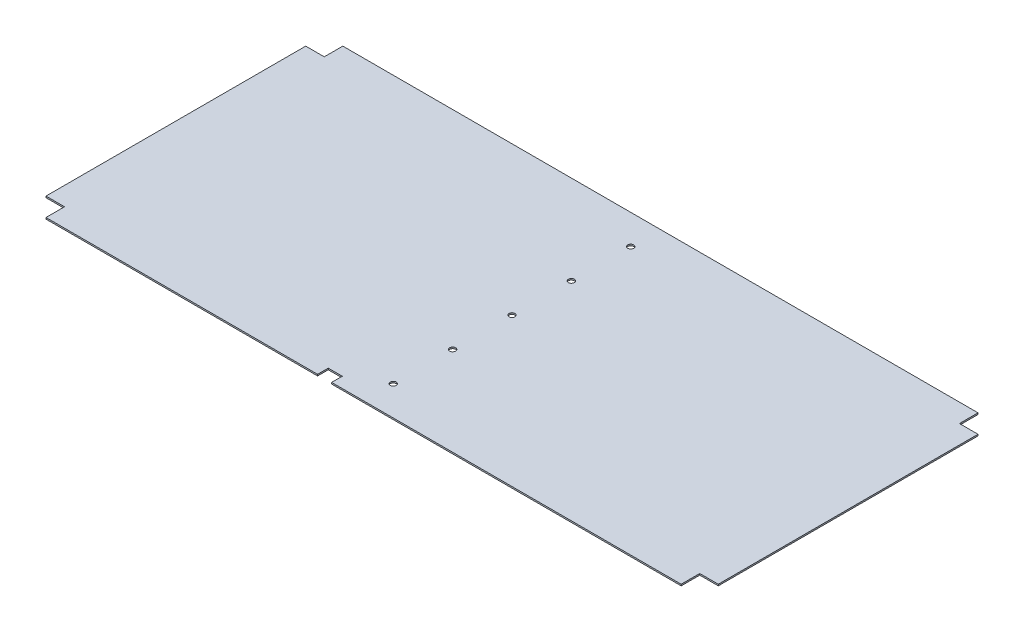
ISO-10303-21;
HEADER;
FILE_DESCRIPTION(('STEP AP214'),'2;1');
FILE_NAME('part.step','',(''),(''),'','','');
FILE_SCHEMA(('AUTOMOTIVE_DESIGN { 1 0 10303 214 1 1 1 1 }'));
ENDSEC;
DATA;
#1=APPLICATION_CONTEXT('core data for automotive mechanical design processes');
#2=APPLICATION_PROTOCOL_DEFINITION('international standard','automotive_design',2000,#1);
#3=PRODUCT_CONTEXT('',#1,'mechanical');
#4=PRODUCT('Part','Part','',(#3));
#5=PRODUCT_RELATED_PRODUCT_CATEGORY('part','',(#4));
#6=PRODUCT_DEFINITION_FORMATION('','',#4);
#7=PRODUCT_DEFINITION_CONTEXT('part definition',#1,'design');
#8=PRODUCT_DEFINITION('design','',#6,#7);
#9=PRODUCT_DEFINITION_SHAPE('','',#8);
#10=(LENGTH_UNIT() NAMED_UNIT(*) SI_UNIT(.MILLI.,.METRE.));
#11=(NAMED_UNIT(*) PLANE_ANGLE_UNIT() SI_UNIT($,.RADIAN.));
#12=(NAMED_UNIT(*) SI_UNIT($,.STERADIAN.) SOLID_ANGLE_UNIT());
#13=UNCERTAINTY_MEASURE_WITH_UNIT(LENGTH_MEASURE(1.E-05),#10,'distance_accuracy_value','');
#14=(GEOMETRIC_REPRESENTATION_CONTEXT(3) GLOBAL_UNCERTAINTY_ASSIGNED_CONTEXT((#13)) GLOBAL_UNIT_ASSIGNED_CONTEXT((#10,
#11,#12)) REPRESENTATION_CONTEXT('',''));
#15=CARTESIAN_POINT('',(0.,0.,0.));
#16=DIRECTION('',(0.,0.,1.));
#17=DIRECTION('',(1.,0.,0.));
#18=AXIS2_PLACEMENT_3D('',#15,#16,#17);
#19=CARTESIAN_POINT('',(-453.,-2.,0.));
#20=DIRECTION('',(0.,0.,1.));
#21=DIRECTION('',(1.,0.,0.));
#22=AXIS2_PLACEMENT_3D('',#19,#20,#21);
#23=PLANE('',#22);
#24=DIRECTION('',(0.,1.,0.));
#25=VECTOR('',#24,1.);
#26=CARTESIAN_POINT('',(-43.0485052879382,-2.,0.));
#27=LINE('',#26,#25);
#28=CARTESIAN_POINT('',(-43.0485052879382,-2.,1.04829763699148E-13));
#29=VERTEX_POINT('',#28);
#30=CARTESIAN_POINT('',(-43.0485052879382,0.,1.04083408558608E-13));
#31=VERTEX_POINT('',#30);
#32=EDGE_CURVE('E184',#29,#31,#27,.T.);
#33=ORIENTED_EDGE('',*,*,#32,.F.);
#34=DIRECTION('',(1.,0.,0.));
#35=VECTOR('',#34,1.);
#36=CARTESIAN_POINT('',(-453.,-2.,0.));
#37=LINE('',#36,#35);
#38=CARTESIAN_POINT('',(428.,-2.,1.04829766007013E-13));
#39=VERTEX_POINT('',#38);
#40=EDGE_CURVE('E267',#29,#39,#37,.T.);
#41=ORIENTED_EDGE('',*,*,#40,.T.);
#42=DIRECTION('',(0.,-1.,0.));
#43=VECTOR('',#42,1.);
#44=CARTESIAN_POINT('',(428.,8.,1.04829766007013E-13));
#45=LINE('',#44,#43);
#46=CARTESIAN_POINT('',(428.,0.,1.04829766007013E-13));
#47=VERTEX_POINT('',#46);
#48=EDGE_CURVE('E223',#47,#39,#45,.T.);
#49=ORIENTED_EDGE('',*,*,#48,.F.);
#50=DIRECTION('',(1.,0.,0.));
#51=VECTOR('',#50,1.);
#52=CARTESIAN_POINT('',(-453.,0.,0.));
#53=LINE('',#52,#51);
#54=EDGE_CURVE('E281',#31,#47,#53,.T.);
#55=ORIENTED_EDGE('',*,*,#54,.F.);
#56=EDGE_LOOP('',(#33,#41,#49,#55));
#57=FACE_BOUND('',#56,.T.);
#58=ADVANCED_FACE('F40',(#57),#23,.T.);
#59=CARTESIAN_POINT('',(-453.,-2.,-400.));
#60=DIRECTION('',(-1.,0.,0.));
#61=DIRECTION('',(0.,0.,1.));
#62=AXIS2_PLACEMENT_3D('',#59,#60,#61);
#63=PLANE('',#62);
#64=DIRECTION('',(0.,-1.,0.));
#65=VECTOR('',#64,1.);
#66=CARTESIAN_POINT('',(-453.,8.,-375.));
#67=LINE('',#66,#65);
#68=CARTESIAN_POINT('',(-453.,0.,-375.));
#69=VERTEX_POINT('',#68);
#70=CARTESIAN_POINT('',(-453.,-2.,-375.));
#71=VERTEX_POINT('',#70);
#72=EDGE_CURVE('E236',#69,#71,#67,.T.);
#73=ORIENTED_EDGE('',*,*,#72,.T.);
#74=DIRECTION('',(0.,0.,1.));
#75=VECTOR('',#74,1.);
#76=CARTESIAN_POINT('',(-453.,-2.,-400.));
#77=LINE('',#76,#75);
#78=CARTESIAN_POINT('',(-453.,-2.,-25.));
#79=VERTEX_POINT('',#78);
#80=EDGE_CURVE('E264',#71,#79,#77,.T.);
#81=ORIENTED_EDGE('',*,*,#80,.T.);
#82=DIRECTION('',(0.,-1.,0.));
#83=VECTOR('',#82,1.);
#84=CARTESIAN_POINT('',(-453.,8.,-25.));
#85=LINE('',#84,#83);
#86=CARTESIAN_POINT('',(-453.,0.,-25.));
#87=VERTEX_POINT('',#86);
#88=EDGE_CURVE('E256',#87,#79,#85,.T.);
#89=ORIENTED_EDGE('',*,*,#88,.F.);
#90=DIRECTION('',(0.,0.,1.));
#91=VECTOR('',#90,1.);
#92=CARTESIAN_POINT('',(-453.,0.,-400.));
#93=LINE('',#92,#91);
#94=EDGE_CURVE('E260',#69,#87,#93,.T.);
#95=ORIENTED_EDGE('',*,*,#94,.F.);
#96=EDGE_LOOP('',(#73,#81,#89,#95));
#97=FACE_BOUND('',#96,.T.);
#98=ADVANCED_FACE('F42',(#97),#63,.T.);
#99=CARTESIAN_POINT('',(-453.,-2.,-400.));
#100=DIRECTION('',(0.,0.,-1.));
#101=DIRECTION('',(-1.,0.,0.));
#102=AXIS2_PLACEMENT_3D('',#99,#100,#101);
#103=PLANE('',#102);
#104=DIRECTION('',(0.,-1.,0.));
#105=VECTOR('',#104,1.);
#106=CARTESIAN_POINT('',(-428.,8.,-400.));
#107=LINE('',#106,#105);
#108=CARTESIAN_POINT('',(-428.,0.,-400.));
#109=VERTEX_POINT('',#108);
#110=CARTESIAN_POINT('',(-428.,-2.,-400.));
#111=VERTEX_POINT('',#110);
#112=EDGE_CURVE('E247',#109,#111,#107,.T.);
#113=ORIENTED_EDGE('',*,*,#112,.F.);
#114=DIRECTION('',(-1.,0.,0.));
#115=VECTOR('',#114,1.);
#116=CARTESIAN_POINT('',(-453.,0.,-400.));
#117=LINE('',#116,#115);
#118=CARTESIAN_POINT('',(428.,0.,-400.));
#119=VERTEX_POINT('',#118);
#120=EDGE_CURVE('E268',#119,#109,#117,.T.);
#121=ORIENTED_EDGE('',*,*,#120,.F.);
#122=DIRECTION('',(0.,-1.,0.));
#123=VECTOR('',#122,1.);
#124=CARTESIAN_POINT('',(428.,8.,-400.));
#125=LINE('',#124,#123);
#126=CARTESIAN_POINT('',(428.,-2.,-400.));
#127=VERTEX_POINT('',#126);
#128=EDGE_CURVE('E221',#119,#127,#125,.T.);
#129=ORIENTED_EDGE('',*,*,#128,.T.);
#130=DIRECTION('',(-1.,0.,0.));
#131=VECTOR('',#130,1.);
#132=CARTESIAN_POINT('',(-453.,-2.,-400.));
#133=LINE('',#132,#131);
#134=EDGE_CURVE('E275',#127,#111,#133,.T.);
#135=ORIENTED_EDGE('',*,*,#134,.T.);
#136=EDGE_LOOP('',(#113,#121,#129,#135));
#137=FACE_BOUND('',#136,.T.);
#138=ADVANCED_FACE('F315',(#137),#103,.T.);
#139=CARTESIAN_POINT('',(453.,-2.,-400.));
#140=DIRECTION('',(1.,0.,0.));
#141=DIRECTION('',(0.,0.,-1.));
#142=AXIS2_PLACEMENT_3D('',#139,#140,#141);
#143=PLANE('',#142);
#144=DIRECTION('',(0.,-1.,0.));
#145=VECTOR('',#144,1.);
#146=CARTESIAN_POINT('',(453.,8.,-375.));
#147=LINE('',#146,#145);
#148=CARTESIAN_POINT('',(453.,0.,-375.));
#149=VERTEX_POINT('',#148);
#150=CARTESIAN_POINT('',(453.,-2.,-375.));
#151=VERTEX_POINT('',#150);
#152=EDGE_CURVE('E238',#149,#151,#147,.T.);
#153=ORIENTED_EDGE('',*,*,#152,.F.);
#154=DIRECTION('',(0.,0.,-1.));
#155=VECTOR('',#154,1.);
#156=CARTESIAN_POINT('',(453.,0.,-400.));
#157=LINE('',#156,#155);
#158=CARTESIAN_POINT('',(453.,0.,-24.9999999999999));
#159=VERTEX_POINT('',#158);
#160=EDGE_CURVE('E283',#159,#149,#157,.T.);
#161=ORIENTED_EDGE('',*,*,#160,.F.);
#162=DIRECTION('',(0.,-1.,0.));
#163=VECTOR('',#162,1.);
#164=CARTESIAN_POINT('',(453.,8.,-24.9999999999999));
#165=LINE('',#164,#163);
#166=CARTESIAN_POINT('',(453.,-2.,-24.9999999999999));
#167=VERTEX_POINT('',#166);
#168=EDGE_CURVE('E224',#159,#167,#165,.T.);
#169=ORIENTED_EDGE('',*,*,#168,.T.);
#170=DIRECTION('',(0.,0.,-1.));
#171=VECTOR('',#170,1.);
#172=CARTESIAN_POINT('',(453.,-2.,-400.));
#173=LINE('',#172,#171);
#174=EDGE_CURVE('E272',#167,#151,#173,.T.);
#175=ORIENTED_EDGE('',*,*,#174,.T.);
#176=EDGE_LOOP('',(#153,#161,#169,#175));
#177=FACE_BOUND('',#176,.T.);
#178=ADVANCED_FACE('F355',(#177),#143,.T.);
#179=DIRECTION('',(0.,-1.,0.));
#180=VECTOR('',#179,1.);
#181=CARTESIAN_POINT('',(-61.9999999999997,-2.,0.));
#182=LINE('',#181,#180);
#183=CARTESIAN_POINT('',(-61.9999999999997,0.,1.04083408558608E-13));
#184=VERTEX_POINT('',#183);
#185=CARTESIAN_POINT('',(-61.9999999999997,-2.,1.04829763699148E-13));
#186=VERTEX_POINT('',#185);
#187=EDGE_CURVE('E179',#184,#186,#182,.T.);
#188=ORIENTED_EDGE('',*,*,#187,.F.);
#189=CARTESIAN_POINT('',(-428.,0.,0.));
#190=VERTEX_POINT('',#189);
#191=EDGE_CURVE('E173',#190,#184,#53,.T.);
#192=ORIENTED_EDGE('',*,*,#191,.F.);
#193=DIRECTION('',(0.,-1.,0.));
#194=VECTOR('',#193,1.);
#195=CARTESIAN_POINT('',(-428.,8.,0.));
#196=LINE('',#195,#194);
#197=CARTESIAN_POINT('',(-428.,-2.,0.));
#198=VERTEX_POINT('',#197);
#199=EDGE_CURVE('E257',#190,#198,#196,.T.);
#200=ORIENTED_EDGE('',*,*,#199,.T.);
#201=EDGE_CURVE('E269',#198,#186,#37,.T.);
#202=ORIENTED_EDGE('',*,*,#201,.T.);
#203=EDGE_LOOP('',(#188,#192,#200,#202));
#204=FACE_BOUND('',#203,.T.);
#205=ADVANCED_FACE('F336',(#204),#23,.T.);
#206=CARTESIAN_POINT('',(0.,-2.,0.));
#207=DIRECTION('',(0.,1.,0.));
#208=DIRECTION('',(0.,0.,1.));
#209=AXIS2_PLACEMENT_3D('',#206,#207,#208);
#210=PLANE('',#209);
#211=ORIENTED_EDGE('',*,*,#40,.F.);
#212=DIRECTION('',(0.,0.,-1.));
#213=VECTOR('',#212,1.);
#214=CARTESIAN_POINT('',(-43.0485052879382,-2.,0.));
#215=LINE('',#214,#213);
#216=CARTESIAN_POINT('',(-43.0485052879382,-2.,-14.371958868348));
#217=VERTEX_POINT('',#216);
#218=EDGE_CURVE('E181',#29,#217,#215,.T.);
#219=ORIENTED_EDGE('',*,*,#218,.T.);
#220=DIRECTION('',(-1.,0.,0.));
#221=VECTOR('',#220,1.);
#222=CARTESIAN_POINT('',(0.,-2.,-14.371958868348));
#223=LINE('',#222,#221);
#224=CARTESIAN_POINT('',(-61.9999999999997,-2.,-14.371958868348));
#225=VERTEX_POINT('',#224);
#226=EDGE_CURVE('E160',#217,#225,#223,.T.);
#227=ORIENTED_EDGE('',*,*,#226,.T.);
#228=DIRECTION('',(0.,0.,1.));
#229=VECTOR('',#228,1.);
#230=CARTESIAN_POINT('',(-61.9999999999997,-2.,0.));
#231=LINE('',#230,#229);
#232=EDGE_CURVE('E158',#225,#186,#231,.T.);
#233=ORIENTED_EDGE('',*,*,#232,.T.);
#234=ORIENTED_EDGE('',*,*,#201,.F.);
#235=DIRECTION('',(0.,0.,1.));
#236=VECTOR('',#235,1.);
#237=CARTESIAN_POINT('',(-428.,-2.,0.));
#238=LINE('',#237,#236);
#239=CARTESIAN_POINT('',(-428.,-2.,-25.));
#240=VERTEX_POINT('',#239);
#241=EDGE_CURVE('E254',#240,#198,#238,.T.);
#242=ORIENTED_EDGE('',*,*,#241,.F.);
#243=DIRECTION('',(1.,0.,0.));
#244=VECTOR('',#243,1.);
#245=CARTESIAN_POINT('',(-453.,-2.,-25.));
#246=LINE('',#245,#244);
#247=EDGE_CURVE('E227',#79,#240,#246,.T.);
#248=ORIENTED_EDGE('',*,*,#247,.F.);
#249=ORIENTED_EDGE('',*,*,#80,.F.);
#250=DIRECTION('',(-1.,0.,0.));
#251=VECTOR('',#250,1.);
#252=CARTESIAN_POINT('',(-453.,-2.,-375.));
#253=LINE('',#252,#251);
#254=CARTESIAN_POINT('',(-428.,-2.,-375.));
#255=VERTEX_POINT('',#254);
#256=EDGE_CURVE('E245',#255,#71,#253,.T.);
#257=ORIENTED_EDGE('',*,*,#256,.F.);
#258=DIRECTION('',(0.,0.,1.));
#259=VECTOR('',#258,1.);
#260=CARTESIAN_POINT('',(-428.,-2.,-400.));
#261=LINE('',#260,#259);
#262=EDGE_CURVE('E216',#111,#255,#261,.T.);
#263=ORIENTED_EDGE('',*,*,#262,.F.);
#264=ORIENTED_EDGE('',*,*,#134,.F.);
#265=DIRECTION('',(0.,0.,-1.));
#266=VECTOR('',#265,1.);
#267=CARTESIAN_POINT('',(428.,-2.,-400.));
#268=LINE('',#267,#266);
#269=CARTESIAN_POINT('',(428.,-2.,-375.));
#270=VERTEX_POINT('',#269);
#271=EDGE_CURVE('E235',#270,#127,#268,.T.);
#272=ORIENTED_EDGE('',*,*,#271,.F.);
#273=DIRECTION('',(-1.,0.,0.));
#274=VECTOR('',#273,1.);
#275=CARTESIAN_POINT('',(453.,-2.,-375.));
#276=LINE('',#275,#274);
#277=EDGE_CURVE('E232',#151,#270,#276,.T.);
#278=ORIENTED_EDGE('',*,*,#277,.F.);
#279=ORIENTED_EDGE('',*,*,#174,.F.);
#280=DIRECTION('',(1.,0.,0.));
#281=VECTOR('',#280,1.);
#282=CARTESIAN_POINT('',(453.,-2.,-24.9999999999999));
#283=LINE('',#282,#281);
#284=CARTESIAN_POINT('',(428.,-2.,-24.9999999999999));
#285=VERTEX_POINT('',#284);
#286=EDGE_CURVE('E220',#285,#167,#283,.T.);
#287=ORIENTED_EDGE('',*,*,#286,.F.);
#288=DIRECTION('',(0.,0.,-1.));
#289=VECTOR('',#288,1.);
#290=CARTESIAN_POINT('',(428.,-2.,1.04829766007013E-13));
#291=LINE('',#290,#289);
#292=EDGE_CURVE('E217',#39,#285,#291,.T.);
#293=ORIENTED_EDGE('',*,*,#292,.F.);
#294=EDGE_LOOP('',(#211,#219,#227,#233,#234,#242,#248,#249,#257,#263,#264,#272,#278,#279,#287,#293));
#295=FACE_BOUND('',#294,.T.);
#296=CARTESIAN_POINT('',(0.,-2.,-360.));
#297=DIRECTION('',(0.,1.,0.));
#298=DIRECTION('',(0.,0.,1.));
#299=AXIS2_PLACEMENT_3D('',#296,#297,#298);
#300=CIRCLE('',#299,4.);
#301=CARTESIAN_POINT('',(0.,-2.,-356.));
#302=VERTEX_POINT('',#301);
#303=EDGE_CURVE('E213',#302,#302,#300,.T.);
#304=ORIENTED_EDGE('',*,*,#303,.T.);
#305=EDGE_LOOP('',(#304));
#306=FACE_BOUND('',#305,.T.);
#307=CARTESIAN_POINT('',(0.,-2.,-280.));
#308=DIRECTION('',(0.,1.,0.));
#309=DIRECTION('',(0.,0.,1.));
#310=AXIS2_PLACEMENT_3D('',#307,#308,#309);
#311=CIRCLE('',#310,4.);
#312=CARTESIAN_POINT('',(0.,-2.,-276.));
#313=VERTEX_POINT('',#312);
#314=EDGE_CURVE('E210',#313,#313,#311,.T.);
#315=ORIENTED_EDGE('',*,*,#314,.T.);
#316=EDGE_LOOP('',(#315));
#317=FACE_BOUND('',#316,.T.);
#318=CARTESIAN_POINT('',(0.,-2.,-200.));
#319=DIRECTION('',(0.,1.,0.));
#320=DIRECTION('',(0.,0.,1.));
#321=AXIS2_PLACEMENT_3D('',#318,#319,#320);
#322=CIRCLE('',#321,4.);
#323=CARTESIAN_POINT('',(0.,-2.,-196.));
#324=VERTEX_POINT('',#323);
#325=EDGE_CURVE('E207',#324,#324,#322,.T.);
#326=ORIENTED_EDGE('',*,*,#325,.T.);
#327=EDGE_LOOP('',(#326));
#328=FACE_BOUND('',#327,.T.);
#329=CARTESIAN_POINT('',(0.,-2.,-120.));
#330=DIRECTION('',(0.,1.,0.));
#331=DIRECTION('',(0.,0.,1.));
#332=AXIS2_PLACEMENT_3D('',#329,#330,#331);
#333=CIRCLE('',#332,4.);
#334=CARTESIAN_POINT('',(0.,-2.,-116.));
#335=VERTEX_POINT('',#334);
#336=EDGE_CURVE('E204',#335,#335,#333,.T.);
#337=ORIENTED_EDGE('',*,*,#336,.T.);
#338=EDGE_LOOP('',(#337));
#339=FACE_BOUND('',#338,.T.);
#340=CARTESIAN_POINT('',(-1.01506105108586E-13,-2.,-39.9999999999999));
#341=DIRECTION('',(0.,1.,0.));
#342=DIRECTION('',(0.,0.,1.));
#343=AXIS2_PLACEMENT_3D('',#340,#341,#342);
#344=CIRCLE('',#343,4.);
#345=CARTESIAN_POINT('',(-1.01506105108586E-13,-2.,-35.9999999999999));
#346=VERTEX_POINT('',#345);
#347=EDGE_CURVE('E190',#346,#346,#344,.T.);
#348=ORIENTED_EDGE('',*,*,#347,.T.);
#349=EDGE_LOOP('',(#348));
#350=FACE_BOUND('',#349,.T.);
#351=ADVANCED_FACE('F320',(#295,#306,#317,#328,#339,#350),#210,.F.);
#352=CARTESIAN_POINT('',(0.,0.,0.));
#353=DIRECTION('',(0.,1.,0.));
#354=DIRECTION('',(0.,0.,1.));
#355=AXIS2_PLACEMENT_3D('',#352,#353,#354);
#356=PLANE('',#355);
#357=DIRECTION('',(0.,0.,-1.));
#358=VECTOR('',#357,1.);
#359=CARTESIAN_POINT('',(-43.0485052879382,0.,0.));
#360=LINE('',#359,#358);
#361=CARTESIAN_POINT('',(-43.0485052879382,0.,-14.371958868348));
#362=VERTEX_POINT('',#361);
#363=EDGE_CURVE('E11',#31,#362,#360,.T.);
#364=ORIENTED_EDGE('',*,*,#363,.F.);
#365=ORIENTED_EDGE('',*,*,#54,.T.);
#366=DIRECTION('',(0.,0.,1.));
#367=VECTOR('',#366,1.);
#368=CARTESIAN_POINT('',(428.,0.,0.));
#369=LINE('',#368,#367);
#370=CARTESIAN_POINT('',(428.,0.,-24.9999999999999));
#371=VERTEX_POINT('',#370);
#372=EDGE_CURVE('E292',#371,#47,#369,.T.);
#373=ORIENTED_EDGE('',*,*,#372,.F.);
#374=DIRECTION('',(-1.,0.,0.));
#375=VECTOR('',#374,1.);
#376=CARTESIAN_POINT('',(0.,0.,-25.));
#377=LINE('',#376,#375);
#378=EDGE_CURVE('E295',#159,#371,#377,.T.);
#379=ORIENTED_EDGE('',*,*,#378,.F.);
#380=ORIENTED_EDGE('',*,*,#160,.T.);
#381=DIRECTION('',(1.,0.,0.));
#382=VECTOR('',#381,1.);
#383=CARTESIAN_POINT('',(-8.32667268468864E-13,0.,-374.999999999999));
#384=LINE('',#383,#382);
#385=CARTESIAN_POINT('',(428.,0.,-375.));
#386=VERTEX_POINT('',#385);
#387=EDGE_CURVE('E298',#386,#149,#384,.T.);
#388=ORIENTED_EDGE('',*,*,#387,.F.);
#389=DIRECTION('',(0.,0.,1.));
#390=VECTOR('',#389,1.);
#391=CARTESIAN_POINT('',(428.,0.,0.));
#392=LINE('',#391,#390);
#393=EDGE_CURVE('E300',#119,#386,#392,.T.);
#394=ORIENTED_EDGE('',*,*,#393,.F.);
#395=ORIENTED_EDGE('',*,*,#120,.T.);
#396=DIRECTION('',(0.,0.,-1.));
#397=VECTOR('',#396,1.);
#398=CARTESIAN_POINT('',(-428.,0.,0.));
#399=LINE('',#398,#397);
#400=CARTESIAN_POINT('',(-428.,0.,-375.));
#401=VERTEX_POINT('',#400);
#402=EDGE_CURVE('E303',#401,#109,#399,.T.);
#403=ORIENTED_EDGE('',*,*,#402,.F.);
#404=DIRECTION('',(1.,0.,0.));
#405=VECTOR('',#404,1.);
#406=CARTESIAN_POINT('',(8.32667268468865E-13,0.,-374.999999999999));
#407=LINE('',#406,#405);
#408=EDGE_CURVE('E48',#69,#401,#407,.T.);
#409=ORIENTED_EDGE('',*,*,#408,.F.);
#410=ORIENTED_EDGE('',*,*,#94,.T.);
#411=DIRECTION('',(-1.,0.,0.));
#412=VECTOR('',#411,1.);
#413=CARTESIAN_POINT('',(0.,0.,-25.));
#414=LINE('',#413,#412);
#415=CARTESIAN_POINT('',(-428.,0.,-25.));
#416=VERTEX_POINT('',#415);
#417=EDGE_CURVE('E278',#416,#87,#414,.T.);
#418=ORIENTED_EDGE('',*,*,#417,.F.);
#419=DIRECTION('',(0.,0.,-1.));
#420=VECTOR('',#419,1.);
#421=CARTESIAN_POINT('',(-428.,0.,0.));
#422=LINE('',#421,#420);
#423=EDGE_CURVE('E289',#190,#416,#422,.T.);
#424=ORIENTED_EDGE('',*,*,#423,.F.);
#425=ORIENTED_EDGE('',*,*,#191,.T.);
#426=DIRECTION('',(0.,0.,1.));
#427=VECTOR('',#426,1.);
#428=CARTESIAN_POINT('',(-61.9999999999997,0.,-14.371958868348));
#429=LINE('',#428,#427);
#430=CARTESIAN_POINT('',(-61.9999999999997,0.,-14.371958868348));
#431=VERTEX_POINT('',#430);
#432=EDGE_CURVE('E155',#431,#184,#429,.T.);
#433=ORIENTED_EDGE('',*,*,#432,.F.);
#434=DIRECTION('',(-1.,0.,0.));
#435=VECTOR('',#434,1.);
#436=CARTESIAN_POINT('',(-43.0485052879382,0.,-14.371958868348));
#437=LINE('',#436,#435);
#438=EDGE_CURVE('E163',#362,#431,#437,.T.);
#439=ORIENTED_EDGE('',*,*,#438,.F.);
#440=EDGE_LOOP('',(#364,#365,#373,#379,#380,#388,#394,#395,#403,#409,#410,#418,#424,#425,#433,#439));
#441=FACE_BOUND('',#440,.T.);
#442=CARTESIAN_POINT('',(0.,0.,-360.));
#443=DIRECTION('',(0.,1.,0.));
#444=DIRECTION('',(0.,0.,1.));
#445=AXIS2_PLACEMENT_3D('',#442,#443,#444);
#446=CIRCLE('',#445,4.);
#447=CARTESIAN_POINT('',(0.,0.,-356.));
#448=VERTEX_POINT('',#447);
#449=EDGE_CURVE('E187',#448,#448,#446,.T.);
#450=ORIENTED_EDGE('',*,*,#449,.F.);
#451=EDGE_LOOP('',(#450));
#452=FACE_BOUND('',#451,.T.);
#453=CARTESIAN_POINT('',(0.,0.,-280.));
#454=DIRECTION('',(0.,1.,0.));
#455=DIRECTION('',(0.,0.,1.));
#456=AXIS2_PLACEMENT_3D('',#453,#454,#455);
#457=CIRCLE('',#456,4.);
#458=CARTESIAN_POINT('',(0.,0.,-276.));
#459=VERTEX_POINT('',#458);
#460=EDGE_CURVE('E191',#459,#459,#457,.T.);
#461=ORIENTED_EDGE('',*,*,#460,.F.);
#462=EDGE_LOOP('',(#461));
#463=FACE_BOUND('',#462,.T.);
#464=CARTESIAN_POINT('',(0.,0.,-200.));
#465=DIRECTION('',(0.,1.,0.));
#466=DIRECTION('',(0.,0.,1.));
#467=AXIS2_PLACEMENT_3D('',#464,#465,#466);
#468=CIRCLE('',#467,4.);
#469=CARTESIAN_POINT('',(0.,0.,-196.));
#470=VERTEX_POINT('',#469);
#471=EDGE_CURVE('E194',#470,#470,#468,.T.);
#472=ORIENTED_EDGE('',*,*,#471,.F.);
#473=EDGE_LOOP('',(#472));
#474=FACE_BOUND('',#473,.T.);
#475=CARTESIAN_POINT('',(0.,0.,-120.));
#476=DIRECTION('',(0.,1.,0.));
#477=DIRECTION('',(0.,0.,1.));
#478=AXIS2_PLACEMENT_3D('',#475,#476,#477);
#479=CIRCLE('',#478,4.);
#480=CARTESIAN_POINT('',(0.,0.,-116.));
#481=VERTEX_POINT('',#480);
#482=EDGE_CURVE('E197',#481,#481,#479,.T.);
#483=ORIENTED_EDGE('',*,*,#482,.F.);
#484=EDGE_LOOP('',(#483));
#485=FACE_BOUND('',#484,.T.);
#486=CARTESIAN_POINT('',(-1.01506105108586E-13,0.,-39.9999999999999));
#487=DIRECTION('',(0.,1.,0.));
#488=DIRECTION('',(0.,0.,1.));
#489=AXIS2_PLACEMENT_3D('',#486,#487,#488);
#490=CIRCLE('',#489,4.);
#491=CARTESIAN_POINT('',(-1.01506105108586E-13,0.,-35.9999999999999));
#492=VERTEX_POINT('',#491);
#493=EDGE_CURVE('E186',#492,#492,#490,.T.);
#494=ORIENTED_EDGE('',*,*,#493,.F.);
#495=EDGE_LOOP('',(#494));
#496=FACE_BOUND('',#495,.T.);
#497=ADVANCED_FACE('F169',(#441,#452,#463,#474,#485,#496),#356,.T.);
#498=CARTESIAN_POINT('',(-428.,8.,0.));
#499=DIRECTION('',(1.,0.,0.));
#500=DIRECTION('',(0.,0.,-1.));
#501=AXIS2_PLACEMENT_3D('',#498,#499,#500);
#502=PLANE('',#501);
#503=ORIENTED_EDGE('',*,*,#423,.T.);
#504=DIRECTION('',(0.,-1.,0.));
#505=VECTOR('',#504,1.);
#506=CARTESIAN_POINT('',(-428.,8.,-25.));
#507=LINE('',#506,#505);
#508=EDGE_CURVE('E261',#416,#240,#507,.T.);
#509=ORIENTED_EDGE('',*,*,#508,.T.);
#510=ORIENTED_EDGE('',*,*,#241,.T.);
#511=ORIENTED_EDGE('',*,*,#199,.F.);
#512=EDGE_LOOP('',(#503,#509,#510,#511));
#513=FACE_BOUND('',#512,.T.);
#514=ADVANCED_FACE('F333',(#513),#502,.F.);
#515=CARTESIAN_POINT('',(-453.,8.,-25.));
#516=DIRECTION('',(0.,0.,-1.));
#517=DIRECTION('',(-1.,0.,0.));
#518=AXIS2_PLACEMENT_3D('',#515,#516,#517);
#519=PLANE('',#518);
#520=ORIENTED_EDGE('',*,*,#417,.T.);
#521=ORIENTED_EDGE('',*,*,#88,.T.);
#522=ORIENTED_EDGE('',*,*,#247,.T.);
#523=ORIENTED_EDGE('',*,*,#508,.F.);
#524=EDGE_LOOP('',(#520,#521,#522,#523));
#525=FACE_BOUND('',#524,.T.);
#526=ADVANCED_FACE('F330',(#525),#519,.F.);
#527=CARTESIAN_POINT('',(453.,8.,-24.9999999999999));
#528=DIRECTION('',(0.,0.,-1.));
#529=DIRECTION('',(-1.,0.,0.));
#530=AXIS2_PLACEMENT_3D('',#527,#528,#529);
#531=PLANE('',#530);
#532=ORIENTED_EDGE('',*,*,#378,.T.);
#533=DIRECTION('',(0.,-1.,0.));
#534=VECTOR('',#533,1.);
#535=CARTESIAN_POINT('',(428.,8.,-24.9999999999999));
#536=LINE('',#535,#534);
#537=EDGE_CURVE('E228',#371,#285,#536,.T.);
#538=ORIENTED_EDGE('',*,*,#537,.T.);
#539=ORIENTED_EDGE('',*,*,#286,.T.);
#540=ORIENTED_EDGE('',*,*,#168,.F.);
#541=EDGE_LOOP('',(#532,#538,#539,#540));
#542=FACE_BOUND('',#541,.T.);
#543=ADVANCED_FACE('F350',(#542),#531,.F.);
#544=CARTESIAN_POINT('',(428.,8.,1.04829766007013E-13));
#545=DIRECTION('',(-1.,0.,0.));
#546=DIRECTION('',(0.,0.,1.));
#547=AXIS2_PLACEMENT_3D('',#544,#545,#546);
#548=PLANE('',#547);
#549=ORIENTED_EDGE('',*,*,#372,.T.);
#550=ORIENTED_EDGE('',*,*,#48,.T.);
#551=ORIENTED_EDGE('',*,*,#292,.T.);
#552=ORIENTED_EDGE('',*,*,#537,.F.);
#553=EDGE_LOOP('',(#549,#550,#551,#552));
#554=FACE_BOUND('',#553,.T.);
#555=ADVANCED_FACE('F346',(#554),#548,.F.);
#556=CARTESIAN_POINT('',(428.,8.,-400.));
#557=DIRECTION('',(-1.,0.,0.));
#558=DIRECTION('',(0.,0.,1.));
#559=AXIS2_PLACEMENT_3D('',#556,#557,#558);
#560=PLANE('',#559);
#561=ORIENTED_EDGE('',*,*,#393,.T.);
#562=DIRECTION('',(0.,-1.,0.));
#563=VECTOR('',#562,1.);
#564=CARTESIAN_POINT('',(428.,8.,-375.));
#565=LINE('',#564,#563);
#566=EDGE_CURVE('E241',#386,#270,#565,.T.);
#567=ORIENTED_EDGE('',*,*,#566,.T.);
#568=ORIENTED_EDGE('',*,*,#271,.T.);
#569=ORIENTED_EDGE('',*,*,#128,.F.);
#570=EDGE_LOOP('',(#561,#567,#568,#569));
#571=FACE_BOUND('',#570,.T.);
#572=ADVANCED_FACE('F360',(#571),#560,.F.);
#573=CARTESIAN_POINT('',(453.,8.,-375.));
#574=DIRECTION('',(0.,0.,1.));
#575=DIRECTION('',(1.,0.,0.));
#576=AXIS2_PLACEMENT_3D('',#573,#574,#575);
#577=PLANE('',#576);
#578=ORIENTED_EDGE('',*,*,#387,.T.);
#579=ORIENTED_EDGE('',*,*,#152,.T.);
#580=ORIENTED_EDGE('',*,*,#277,.T.);
#581=ORIENTED_EDGE('',*,*,#566,.F.);
#582=EDGE_LOOP('',(#578,#579,#580,#581));
#583=FACE_BOUND('',#582,.T.);
#584=ADVANCED_FACE('F358',(#583),#577,.F.);
#585=CARTESIAN_POINT('',(-453.,8.,-375.));
#586=DIRECTION('',(0.,0.,1.));
#587=DIRECTION('',(1.,0.,0.));
#588=AXIS2_PLACEMENT_3D('',#585,#586,#587);
#589=PLANE('',#588);
#590=ORIENTED_EDGE('',*,*,#408,.T.);
#591=DIRECTION('',(0.,-1.,0.));
#592=VECTOR('',#591,1.);
#593=CARTESIAN_POINT('',(-428.,8.,-375.));
#594=LINE('',#593,#592);
#595=EDGE_CURVE('E62',#401,#255,#594,.T.);
#596=ORIENTED_EDGE('',*,*,#595,.T.);
#597=ORIENTED_EDGE('',*,*,#256,.T.);
#598=ORIENTED_EDGE('',*,*,#72,.F.);
#599=EDGE_LOOP('',(#590,#596,#597,#598));
#600=FACE_BOUND('',#599,.T.);
#601=ADVANCED_FACE('F307',(#600),#589,.F.);
#602=CARTESIAN_POINT('',(-428.,8.,-400.));
#603=DIRECTION('',(1.,0.,0.));
#604=DIRECTION('',(0.,0.,-1.));
#605=AXIS2_PLACEMENT_3D('',#602,#603,#604);
#606=PLANE('',#605);
#607=ORIENTED_EDGE('',*,*,#402,.T.);
#608=ORIENTED_EDGE('',*,*,#112,.T.);
#609=ORIENTED_EDGE('',*,*,#262,.T.);
#610=ORIENTED_EDGE('',*,*,#595,.F.);
#611=EDGE_LOOP('',(#607,#608,#609,#610));
#612=FACE_BOUND('',#611,.T.);
#613=ADVANCED_FACE('F312',(#612),#606,.F.);
#614=CARTESIAN_POINT('',(-1.01506105108586E-13,-10.,-39.9999999999999));
#615=DIRECTION('',(0.,1.,0.));
#616=DIRECTION('',(0.,0.,1.));
#617=AXIS2_PLACEMENT_3D('',#614,#615,#616);
#618=CYLINDRICAL_SURFACE('',#617,4.);
#619=ORIENTED_EDGE('',*,*,#493,.T.);
#620=EDGE_LOOP('',(#619));
#621=FACE_BOUND('',#620,.T.);
#622=ORIENTED_EDGE('',*,*,#347,.F.);
#623=EDGE_LOOP('',(#622));
#624=FACE_BOUND('',#623,.T.);
#625=ADVANCED_FACE('F394',(#621,#624),#618,.F.);
#626=CARTESIAN_POINT('',(0.,-10.,-120.));
#627=DIRECTION('',(0.,1.,0.));
#628=DIRECTION('',(0.,0.,1.));
#629=AXIS2_PLACEMENT_3D('',#626,#627,#628);
#630=CYLINDRICAL_SURFACE('',#629,4.);
#631=ORIENTED_EDGE('',*,*,#482,.T.);
#632=EDGE_LOOP('',(#631));
#633=FACE_BOUND('',#632,.T.);
#634=ORIENTED_EDGE('',*,*,#336,.F.);
#635=EDGE_LOOP('',(#634));
#636=FACE_BOUND('',#635,.T.);
#637=ADVANCED_FACE('F410',(#633,#636),#630,.F.);
#638=CARTESIAN_POINT('',(0.,-10.,-200.));
#639=DIRECTION('',(0.,1.,0.));
#640=DIRECTION('',(0.,0.,1.));
#641=AXIS2_PLACEMENT_3D('',#638,#639,#640);
#642=CYLINDRICAL_SURFACE('',#641,4.);
#643=ORIENTED_EDGE('',*,*,#471,.T.);
#644=EDGE_LOOP('',(#643));
#645=FACE_BOUND('',#644,.T.);
#646=ORIENTED_EDGE('',*,*,#325,.F.);
#647=EDGE_LOOP('',(#646));
#648=FACE_BOUND('',#647,.T.);
#649=ADVANCED_FACE('F418',(#645,#648),#642,.F.);
#650=CARTESIAN_POINT('',(0.,-10.,-280.));
#651=DIRECTION('',(0.,1.,0.));
#652=DIRECTION('',(0.,0.,1.));
#653=AXIS2_PLACEMENT_3D('',#650,#651,#652);
#654=CYLINDRICAL_SURFACE('',#653,4.);
#655=ORIENTED_EDGE('',*,*,#460,.T.);
#656=EDGE_LOOP('',(#655));
#657=FACE_BOUND('',#656,.T.);
#658=ORIENTED_EDGE('',*,*,#314,.F.);
#659=EDGE_LOOP('',(#658));
#660=FACE_BOUND('',#659,.T.);
#661=ADVANCED_FACE('F426',(#657,#660),#654,.F.);
#662=CARTESIAN_POINT('',(0.,-10.,-360.));
#663=DIRECTION('',(0.,1.,0.));
#664=DIRECTION('',(0.,0.,1.));
#665=AXIS2_PLACEMENT_3D('',#662,#663,#664);
#666=CYLINDRICAL_SURFACE('',#665,4.);
#667=ORIENTED_EDGE('',*,*,#449,.T.);
#668=EDGE_LOOP('',(#667));
#669=FACE_BOUND('',#668,.T.);
#670=ORIENTED_EDGE('',*,*,#303,.F.);
#671=EDGE_LOOP('',(#670));
#672=FACE_BOUND('',#671,.T.);
#673=ADVANCED_FACE('F434',(#669,#672),#666,.F.);
#674=CARTESIAN_POINT('',(-43.0485052879382,-10.,-14.371958868348));
#675=DIRECTION('',(0.,0.,-1.));
#676=DIRECTION('',(-1.,0.,0.));
#677=AXIS2_PLACEMENT_3D('',#674,#675,#676);
#678=PLANE('',#677);
#679=DIRECTION('',(0.,1.,0.));
#680=VECTOR('',#679,1.);
#681=CARTESIAN_POINT('',(-43.0485052879382,-10.,-14.371958868348));
#682=LINE('',#681,#680);
#683=EDGE_CURVE('E55',#217,#362,#682,.T.);
#684=ORIENTED_EDGE('',*,*,#683,.T.);
#685=ORIENTED_EDGE('',*,*,#438,.T.);
#686=DIRECTION('',(0.,1.,0.));
#687=VECTOR('',#686,1.);
#688=CARTESIAN_POINT('',(-61.9999999999997,-10.,-14.371958868348));
#689=LINE('',#688,#687);
#690=EDGE_CURVE('E152',#225,#431,#689,.T.);
#691=ORIENTED_EDGE('',*,*,#690,.F.);
#692=ORIENTED_EDGE('',*,*,#226,.F.);
#693=EDGE_LOOP('',(#684,#685,#691,#692));
#694=FACE_BOUND('',#693,.T.);
#695=ADVANCED_FACE('F164',(#694),#678,.F.);
#696=CARTESIAN_POINT('',(-43.0485052879382,-10.,-14.371958868348));
#697=DIRECTION('',(1.,0.,0.));
#698=DIRECTION('',(0.,0.,-1.));
#699=AXIS2_PLACEMENT_3D('',#696,#697,#698);
#700=PLANE('',#699);
#701=ORIENTED_EDGE('',*,*,#32,.T.);
#702=ORIENTED_EDGE('',*,*,#363,.T.);
#703=ORIENTED_EDGE('',*,*,#683,.F.);
#704=ORIENTED_EDGE('',*,*,#218,.F.);
#705=EDGE_LOOP('',(#701,#702,#703,#704));
#706=FACE_BOUND('',#705,.T.);
#707=ADVANCED_FACE('F338',(#706),#700,.F.);
#708=CARTESIAN_POINT('',(-61.9999999999997,-10.,-14.371958868348));
#709=DIRECTION('',(-1.,0.,0.));
#710=DIRECTION('',(0.,0.,1.));
#711=AXIS2_PLACEMENT_3D('',#708,#709,#710);
#712=PLANE('',#711);
#713=ORIENTED_EDGE('',*,*,#187,.T.);
#714=ORIENTED_EDGE('',*,*,#232,.F.);
#715=ORIENTED_EDGE('',*,*,#690,.T.);
#716=ORIENTED_EDGE('',*,*,#432,.T.);
#717=EDGE_LOOP('',(#713,#714,#715,#716));
#718=FACE_BOUND('',#717,.T.);
#719=ADVANCED_FACE('F153',(#718),#712,.F.);
#720=CLOSED_SHELL('',(#58,#98,#138,#178,#205,#351,#497,#514,#526,#543,#555,#572,#584,#601,#613,
#625,#637,#649,#661,#673,#695,#707,#719));
#721=MANIFOLD_SOLID_BREP('B2',#720);
#722=ADVANCED_BREP_SHAPE_REPRESENTATION('',(#18,#721),#14);
#723=SHAPE_DEFINITION_REPRESENTATION(#9,#722);
ENDSEC;
END-ISO-10303-21;
